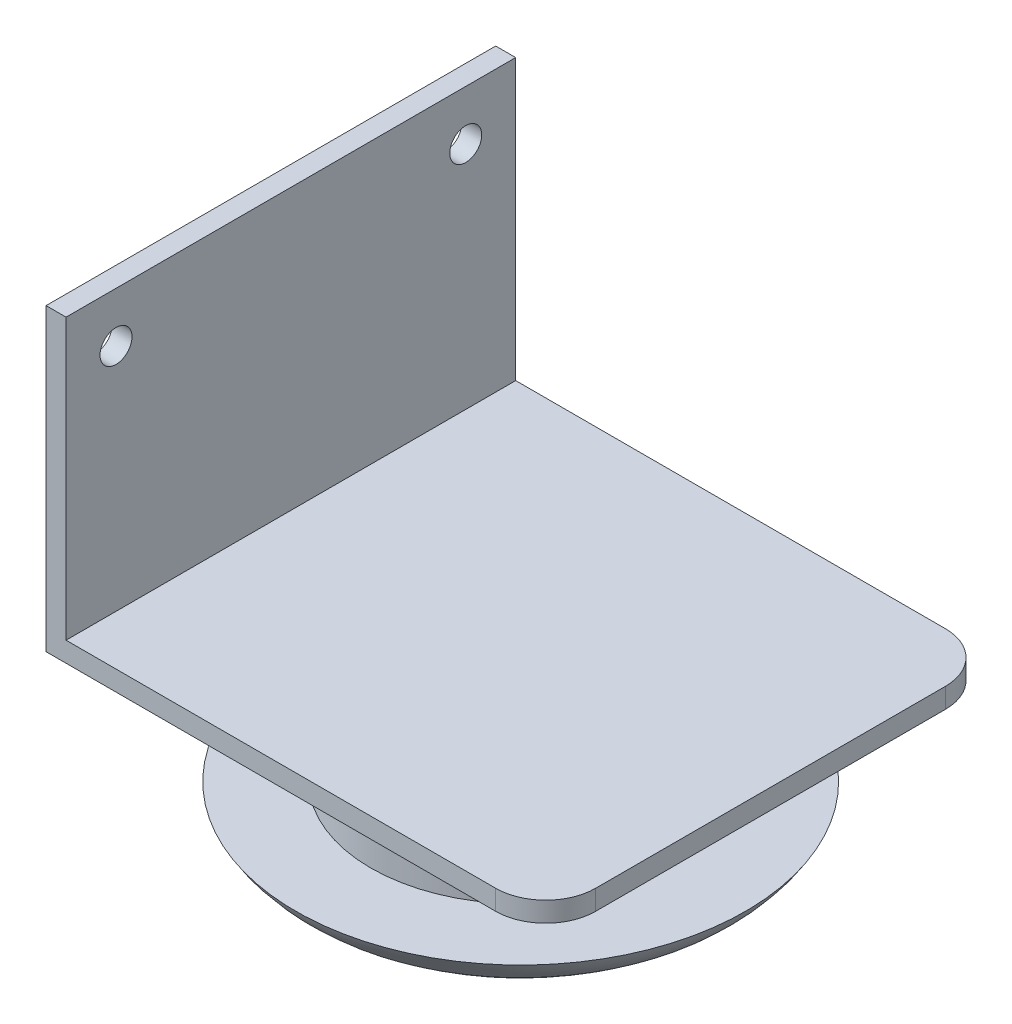
ISO-10303-21;
HEADER;
FILE_DESCRIPTION(('STEP AP214'),'2;1');
FILE_NAME('part.step','',(''),(''),'','','');
FILE_SCHEMA(('AUTOMOTIVE_DESIGN { 1 0 10303 214 1 1 1 1 }'));
ENDSEC;
DATA;
#1=APPLICATION_CONTEXT('core data for automotive mechanical design processes');
#2=APPLICATION_PROTOCOL_DEFINITION('international standard','automotive_design',2000,#1);
#3=PRODUCT_CONTEXT('',#1,'mechanical');
#4=PRODUCT('Part','Part','',(#3));
#5=PRODUCT_RELATED_PRODUCT_CATEGORY('part','',(#4));
#6=PRODUCT_DEFINITION_FORMATION('','',#4);
#7=PRODUCT_DEFINITION_CONTEXT('part definition',#1,'design');
#8=PRODUCT_DEFINITION('design','',#6,#7);
#9=PRODUCT_DEFINITION_SHAPE('','',#8);
#10=(LENGTH_UNIT() NAMED_UNIT(*) SI_UNIT(.MILLI.,.METRE.));
#11=(NAMED_UNIT(*) PLANE_ANGLE_UNIT() SI_UNIT($,.RADIAN.));
#12=(NAMED_UNIT(*) SI_UNIT($,.STERADIAN.) SOLID_ANGLE_UNIT());
#13=UNCERTAINTY_MEASURE_WITH_UNIT(LENGTH_MEASURE(1.E-05),#10,'distance_accuracy_value','');
#14=(GEOMETRIC_REPRESENTATION_CONTEXT(3) GLOBAL_UNCERTAINTY_ASSIGNED_CONTEXT((#13)) GLOBAL_UNIT_ASSIGNED_CONTEXT((#10,
#11,#12)) REPRESENTATION_CONTEXT('',''));
#15=CARTESIAN_POINT('',(0.,0.,0.));
#16=DIRECTION('',(0.,0.,1.));
#17=DIRECTION('',(1.,0.,0.));
#18=AXIS2_PLACEMENT_3D('',#15,#16,#17);
#19=CARTESIAN_POINT('',(0.,30.,45.));
#20=DIRECTION('',(0.,-1.,0.));
#21=DIRECTION('',(0.,0.,-1.));
#22=AXIS2_PLACEMENT_3D('',#19,#20,#21);
#23=PLANE('',#22);
#24=DIRECTION('',(-1.,0.,0.));
#25=VECTOR('',#24,1.);
#26=CARTESIAN_POINT('',(0.,30.,0.));
#27=LINE('',#26,#25);
#28=CARTESIAN_POINT('',(2.,30.,0.));
#29=VERTEX_POINT('',#28);
#30=CARTESIAN_POINT('',(0.,30.,0.));
#31=VERTEX_POINT('',#30);
#32=EDGE_CURVE('E126',#29,#31,#27,.T.);
#33=ORIENTED_EDGE('',*,*,#32,.T.);
#34=DIRECTION('',(0.,0.,-1.));
#35=VECTOR('',#34,1.);
#36=CARTESIAN_POINT('',(0.,30.,45.));
#37=LINE('',#36,#35);
#38=CARTESIAN_POINT('',(0.,30.,45.));
#39=VERTEX_POINT('',#38);
#40=EDGE_CURVE('E108',#39,#31,#37,.T.);
#41=ORIENTED_EDGE('',*,*,#40,.F.);
#42=DIRECTION('',(-1.,0.,0.));
#43=VECTOR('',#42,1.);
#44=CARTESIAN_POINT('',(0.,30.,45.));
#45=LINE('',#44,#43);
#46=CARTESIAN_POINT('',(2.,30.,45.));
#47=VERTEX_POINT('',#46);
#48=EDGE_CURVE('E114',#47,#39,#45,.T.);
#49=ORIENTED_EDGE('',*,*,#48,.F.);
#50=DIRECTION('',(0.,0.,-1.));
#51=VECTOR('',#50,1.);
#52=CARTESIAN_POINT('',(2.,30.,45.));
#53=LINE('',#52,#51);
#54=EDGE_CURVE('E184',#47,#29,#53,.T.);
#55=ORIENTED_EDGE('',*,*,#54,.T.);
#56=EDGE_LOOP('',(#33,#41,#49,#55));
#57=FACE_BOUND('',#56,.T.);
#58=ADVANCED_FACE('F35',(#57),#23,.F.);
#59=CARTESIAN_POINT('',(0.,30.,45.));
#60=DIRECTION('',(1.,0.,0.));
#61=DIRECTION('',(0.,0.,-1.));
#62=AXIS2_PLACEMENT_3D('',#59,#60,#61);
#63=PLANE('',#62);
#64=CARTESIAN_POINT('',(0.,25.,5.));
#65=DIRECTION('',(-1.,0.,0.));
#66=DIRECTION('',(0.,0.,1.));
#67=AXIS2_PLACEMENT_3D('',#64,#65,#66);
#68=CIRCLE('',#67,1.6);
#69=CARTESIAN_POINT('',(0.,25.,6.6));
#70=VERTEX_POINT('',#69);
#71=EDGE_CURVE('E141',#70,#70,#68,.T.);
#72=ORIENTED_EDGE('',*,*,#71,.F.);
#73=EDGE_LOOP('',(#72));
#74=FACE_BOUND('',#73,.T.);
#75=CARTESIAN_POINT('',(0.,25.,40.));
#76=DIRECTION('',(-1.,0.,0.));
#77=DIRECTION('',(0.,0.,1.));
#78=AXIS2_PLACEMENT_3D('',#75,#76,#77);
#79=CIRCLE('',#78,1.6);
#80=CARTESIAN_POINT('',(0.,25.,41.6));
#81=VERTEX_POINT('',#80);
#82=EDGE_CURVE('E138',#81,#81,#79,.T.);
#83=ORIENTED_EDGE('',*,*,#82,.F.);
#84=EDGE_LOOP('',(#83));
#85=FACE_BOUND('',#84,.T.);
#86=DIRECTION('',(0.,-1.,0.));
#87=VECTOR('',#86,1.);
#88=CARTESIAN_POINT('',(0.,30.,0.));
#89=LINE('',#88,#87);
#90=CARTESIAN_POINT('',(0.,0.,0.));
#91=VERTEX_POINT('',#90);
#92=EDGE_CURVE('E168',#31,#91,#89,.T.);
#93=ORIENTED_EDGE('',*,*,#92,.T.);
#94=DIRECTION('',(0.,0.,-1.));
#95=VECTOR('',#94,1.);
#96=CARTESIAN_POINT('',(0.,0.,45.));
#97=LINE('',#96,#95);
#98=CARTESIAN_POINT('',(0.,0.,45.));
#99=VERTEX_POINT('',#98);
#100=EDGE_CURVE('E111',#99,#91,#97,.T.);
#101=ORIENTED_EDGE('',*,*,#100,.F.);
#102=DIRECTION('',(0.,-1.,0.));
#103=VECTOR('',#102,1.);
#104=CARTESIAN_POINT('',(0.,30.,45.));
#105=LINE('',#104,#103);
#106=EDGE_CURVE('E104',#39,#99,#105,.T.);
#107=ORIENTED_EDGE('',*,*,#106,.F.);
#108=ORIENTED_EDGE('',*,*,#40,.T.);
#109=EDGE_LOOP('',(#93,#101,#107,#108));
#110=FACE_BOUND('',#109,.T.);
#111=ADVANCED_FACE('F106',(#74,#85,#110),#63,.F.);
#112=CARTESIAN_POINT('',(0.,0.,45.));
#113=DIRECTION('',(0.,1.,0.));
#114=DIRECTION('',(0.,0.,1.));
#115=AXIS2_PLACEMENT_3D('',#112,#113,#114);
#116=PLANE('',#115);
#117=CARTESIAN_POINT('',(25.,0.,22.5));
#118=DIRECTION('',(0.,1.,0.));
#119=DIRECTION('',(0.,0.,1.));
#120=AXIS2_PLACEMENT_3D('',#117,#118,#119);
#121=CIRCLE('',#120,15.);
#122=CARTESIAN_POINT('',(25.,0.,37.5));
#123=VERTEX_POINT('',#122);
#124=EDGE_CURVE('E43',#123,#123,#121,.F.);
#125=ORIENTED_EDGE('',*,*,#124,.F.);
#126=EDGE_LOOP('',(#125));
#127=FACE_BOUND('',#126,.T.);
#128=DIRECTION('',(1.,0.,0.));
#129=VECTOR('',#128,1.);
#130=CARTESIAN_POINT('',(0.,0.,0.));
#131=LINE('',#130,#129);
#132=CARTESIAN_POINT('',(45.,0.,0.));
#133=VERTEX_POINT('',#132);
#134=EDGE_CURVE('E164',#91,#133,#131,.T.);
#135=ORIENTED_EDGE('',*,*,#134,.T.);
#136=CARTESIAN_POINT('',(45.,0.,5.));
#137=DIRECTION('',(0.,1.,0.));
#138=DIRECTION('',(0.,0.,1.));
#139=AXIS2_PLACEMENT_3D('',#136,#137,#138);
#140=CIRCLE('',#139,5.);
#141=CARTESIAN_POINT('',(50.,0.,5.00000000000001));
#142=VERTEX_POINT('',#141);
#143=EDGE_CURVE('E151',#133,#142,#140,.F.);
#144=ORIENTED_EDGE('',*,*,#143,.T.);
#145=DIRECTION('',(0.,0.,-1.));
#146=VECTOR('',#145,1.);
#147=CARTESIAN_POINT('',(50.,0.,45.));
#148=LINE('',#147,#146);
#149=CARTESIAN_POINT('',(50.,0.,40.));
#150=VERTEX_POINT('',#149);
#151=EDGE_CURVE('E131',#150,#142,#148,.T.);
#152=ORIENTED_EDGE('',*,*,#151,.F.);
#153=CARTESIAN_POINT('',(45.,0.,40.));
#154=DIRECTION('',(0.,1.,0.));
#155=DIRECTION('',(0.,0.,1.));
#156=AXIS2_PLACEMENT_3D('',#153,#154,#155);
#157=CIRCLE('',#156,5.);
#158=CARTESIAN_POINT('',(45.,0.,45.));
#159=VERTEX_POINT('',#158);
#160=EDGE_CURVE('E50',#150,#159,#157,.F.);
#161=ORIENTED_EDGE('',*,*,#160,.T.);
#162=DIRECTION('',(1.,0.,0.));
#163=VECTOR('',#162,1.);
#164=CARTESIAN_POINT('',(0.,0.,45.));
#165=LINE('',#164,#163);
#166=EDGE_CURVE('E113',#99,#159,#165,.T.);
#167=ORIENTED_EDGE('',*,*,#166,.F.);
#168=ORIENTED_EDGE('',*,*,#100,.T.);
#169=EDGE_LOOP('',(#135,#144,#152,#161,#167,#168));
#170=FACE_BOUND('',#169,.T.);
#171=ADVANCED_FACE('F160',(#127,#170),#116,.F.);
#172=CARTESIAN_POINT('',(50.,2.,45.));
#173=DIRECTION('',(-1.,0.,0.));
#174=DIRECTION('',(0.,0.,1.));
#175=AXIS2_PLACEMENT_3D('',#172,#173,#174);
#176=PLANE('',#175);
#177=ORIENTED_EDGE('',*,*,#151,.T.);
#178=DIRECTION('',(0.,1.,0.));
#179=VECTOR('',#178,1.);
#180=CARTESIAN_POINT('',(50.,2.,5.));
#181=LINE('',#180,#179);
#182=CARTESIAN_POINT('',(50.,2.,5.00000000000001));
#183=VERTEX_POINT('',#182);
#184=EDGE_CURVE('E129',#142,#183,#181,.T.);
#185=ORIENTED_EDGE('',*,*,#184,.T.);
#186=DIRECTION('',(0.,0.,-1.));
#187=VECTOR('',#186,1.);
#188=CARTESIAN_POINT('',(50.,2.,45.));
#189=LINE('',#188,#187);
#190=CARTESIAN_POINT('',(50.,2.,40.));
#191=VERTEX_POINT('',#190);
#192=EDGE_CURVE('E176',#191,#183,#189,.T.);
#193=ORIENTED_EDGE('',*,*,#192,.F.);
#194=DIRECTION('',(0.,1.,0.));
#195=VECTOR('',#194,1.);
#196=CARTESIAN_POINT('',(50.,2.,40.));
#197=LINE('',#196,#195);
#198=EDGE_CURVE('E127',#191,#150,#197,.F.);
#199=ORIENTED_EDGE('',*,*,#198,.T.);
#200=EDGE_LOOP('',(#177,#185,#193,#199));
#201=FACE_BOUND('',#200,.T.);
#202=ADVANCED_FACE('F162',(#201),#176,.F.);
#203=CARTESIAN_POINT('',(2.,2.,45.));
#204=DIRECTION('',(0.,-1.,0.));
#205=DIRECTION('',(0.,0.,-1.));
#206=AXIS2_PLACEMENT_3D('',#203,#204,#205);
#207=PLANE('',#206);
#208=ORIENTED_EDGE('',*,*,#192,.T.);
#209=CARTESIAN_POINT('',(45.,2.,5.));
#210=DIRECTION('',(0.,-1.,0.));
#211=DIRECTION('',(0.,0.,-1.));
#212=AXIS2_PLACEMENT_3D('',#209,#210,#211);
#213=CIRCLE('',#212,5.);
#214=CARTESIAN_POINT('',(45.,2.,0.));
#215=VERTEX_POINT('',#214);
#216=EDGE_CURVE('E147',#183,#215,#213,.F.);
#217=ORIENTED_EDGE('',*,*,#216,.T.);
#218=DIRECTION('',(-1.,0.,0.));
#219=VECTOR('',#218,1.);
#220=CARTESIAN_POINT('',(2.,2.,0.));
#221=LINE('',#220,#219);
#222=CARTESIAN_POINT('',(2.,2.,0.));
#223=VERTEX_POINT('',#222);
#224=EDGE_CURVE('E167',#215,#223,#221,.T.);
#225=ORIENTED_EDGE('',*,*,#224,.T.);
#226=DIRECTION('',(0.,0.,-1.));
#227=VECTOR('',#226,1.);
#228=CARTESIAN_POINT('',(2.,2.,45.));
#229=LINE('',#228,#227);
#230=CARTESIAN_POINT('',(2.,2.,45.));
#231=VERTEX_POINT('',#230);
#232=EDGE_CURVE('E181',#231,#223,#229,.T.);
#233=ORIENTED_EDGE('',*,*,#232,.F.);
#234=DIRECTION('',(-1.,0.,0.));
#235=VECTOR('',#234,1.);
#236=CARTESIAN_POINT('',(2.,2.,45.));
#237=LINE('',#236,#235);
#238=CARTESIAN_POINT('',(45.,2.,45.));
#239=VERTEX_POINT('',#238);
#240=EDGE_CURVE('E193',#239,#231,#237,.T.);
#241=ORIENTED_EDGE('',*,*,#240,.F.);
#242=CARTESIAN_POINT('',(45.,2.,40.));
#243=DIRECTION('',(0.,-1.,0.));
#244=DIRECTION('',(0.,0.,-1.));
#245=AXIS2_PLACEMENT_3D('',#242,#243,#244);
#246=CIRCLE('',#245,5.);
#247=EDGE_CURVE('E145',#239,#191,#246,.F.);
#248=ORIENTED_EDGE('',*,*,#247,.T.);
#249=EDGE_LOOP('',(#208,#217,#225,#233,#241,#248));
#250=FACE_BOUND('',#249,.T.);
#251=ADVANCED_FACE('F179',(#250),#207,.F.);
#252=CARTESIAN_POINT('',(2.,30.,45.));
#253=DIRECTION('',(-1.,0.,0.));
#254=DIRECTION('',(0.,-1.,0.));
#255=AXIS2_PLACEMENT_3D('',#252,#253,#254);
#256=PLANE('',#255);
#257=CARTESIAN_POINT('',(2.,25.,5.));
#258=DIRECTION('',(-1.,0.,0.));
#259=DIRECTION('',(0.,-1.,0.));
#260=AXIS2_PLACEMENT_3D('',#257,#258,#259);
#261=CIRCLE('',#260,1.6);
#262=CARTESIAN_POINT('',(2.,23.4,5.));
#263=VERTEX_POINT('',#262);
#264=EDGE_CURVE('E139',#263,#263,#261,.T.);
#265=ORIENTED_EDGE('',*,*,#264,.T.);
#266=EDGE_LOOP('',(#265));
#267=FACE_BOUND('',#266,.T.);
#268=CARTESIAN_POINT('',(2.,25.,40.));
#269=DIRECTION('',(-1.,0.,0.));
#270=DIRECTION('',(0.,-1.,0.));
#271=AXIS2_PLACEMENT_3D('',#268,#269,#270);
#272=CIRCLE('',#271,1.6);
#273=CARTESIAN_POINT('',(2.,23.4,40.));
#274=VERTEX_POINT('',#273);
#275=EDGE_CURVE('E135',#274,#274,#272,.T.);
#276=ORIENTED_EDGE('',*,*,#275,.T.);
#277=EDGE_LOOP('',(#276));
#278=FACE_BOUND('',#277,.T.);
#279=DIRECTION('',(0.,1.,0.));
#280=VECTOR('',#279,1.);
#281=CARTESIAN_POINT('',(2.,30.,0.));
#282=LINE('',#281,#280);
#283=EDGE_CURVE('E123',#223,#29,#282,.T.);
#284=ORIENTED_EDGE('',*,*,#283,.T.);
#285=ORIENTED_EDGE('',*,*,#54,.F.);
#286=DIRECTION('',(0.,1.,0.));
#287=VECTOR('',#286,1.);
#288=CARTESIAN_POINT('',(2.,30.,45.));
#289=LINE('',#288,#287);
#290=EDGE_CURVE('E119',#231,#47,#289,.T.);
#291=ORIENTED_EDGE('',*,*,#290,.F.);
#292=ORIENTED_EDGE('',*,*,#232,.T.);
#293=EDGE_LOOP('',(#284,#285,#291,#292));
#294=FACE_BOUND('',#293,.T.);
#295=ADVANCED_FACE('F242',(#267,#278,#294),#256,.F.);
#296=CARTESIAN_POINT('',(0.,0.,45.));
#297=DIRECTION('',(0.,0.,-1.));
#298=DIRECTION('',(-1.,0.,0.));
#299=AXIS2_PLACEMENT_3D('',#296,#297,#298);
#300=PLANE('',#299);
#301=ORIENTED_EDGE('',*,*,#166,.T.);
#302=DIRECTION('',(0.,1.,0.));
#303=VECTOR('',#302,1.);
#304=CARTESIAN_POINT('',(45.,0.,45.));
#305=LINE('',#304,#303);
#306=EDGE_CURVE('E153',#159,#239,#305,.T.);
#307=ORIENTED_EDGE('',*,*,#306,.T.);
#308=ORIENTED_EDGE('',*,*,#240,.T.);
#309=ORIENTED_EDGE('',*,*,#290,.T.);
#310=ORIENTED_EDGE('',*,*,#48,.T.);
#311=ORIENTED_EDGE('',*,*,#106,.T.);
#312=EDGE_LOOP('',(#301,#307,#308,#309,#310,#311));
#313=FACE_BOUND('',#312,.T.);
#314=ADVANCED_FACE('F117',(#313),#300,.F.);
#315=CARTESIAN_POINT('',(0.,0.,0.));
#316=DIRECTION('',(0.,0.,-1.));
#317=DIRECTION('',(-1.,0.,0.));
#318=AXIS2_PLACEMENT_3D('',#315,#316,#317);
#319=PLANE('',#318);
#320=ORIENTED_EDGE('',*,*,#224,.F.);
#321=DIRECTION('',(0.,1.,0.));
#322=VECTOR('',#321,1.);
#323=CARTESIAN_POINT('',(45.,0.,0.));
#324=LINE('',#323,#322);
#325=EDGE_CURVE('E58',#215,#133,#324,.F.);
#326=ORIENTED_EDGE('',*,*,#325,.T.);
#327=ORIENTED_EDGE('',*,*,#134,.F.);
#328=ORIENTED_EDGE('',*,*,#92,.F.);
#329=ORIENTED_EDGE('',*,*,#32,.F.);
#330=ORIENTED_EDGE('',*,*,#283,.F.);
#331=EDGE_LOOP('',(#320,#326,#327,#328,#329,#330));
#332=FACE_BOUND('',#331,.T.);
#333=ADVANCED_FACE('F243',(#332),#319,.T.);
#334=CARTESIAN_POINT('',(35.,25.,40.));
#335=DIRECTION('',(-1.,0.,0.));
#336=DIRECTION('',(0.,0.,1.));
#337=AXIS2_PLACEMENT_3D('',#334,#335,#336);
#338=CYLINDRICAL_SURFACE('',#337,1.6);
#339=ORIENTED_EDGE('',*,*,#82,.T.);
#340=EDGE_LOOP('',(#339));
#341=FACE_BOUND('',#340,.T.);
#342=ORIENTED_EDGE('',*,*,#275,.F.);
#343=EDGE_LOOP('',(#342));
#344=FACE_BOUND('',#343,.T.);
#345=ADVANCED_FACE('F245',(#341,#344),#338,.F.);
#346=CARTESIAN_POINT('',(35.,25.,5.));
#347=DIRECTION('',(-1.,0.,0.));
#348=DIRECTION('',(0.,0.,1.));
#349=AXIS2_PLACEMENT_3D('',#346,#347,#348);
#350=CYLINDRICAL_SURFACE('',#349,1.6);
#351=ORIENTED_EDGE('',*,*,#71,.T.);
#352=EDGE_LOOP('',(#351));
#353=FACE_BOUND('',#352,.T.);
#354=ORIENTED_EDGE('',*,*,#264,.F.);
#355=EDGE_LOOP('',(#354));
#356=FACE_BOUND('',#355,.T.);
#357=ADVANCED_FACE('F231',(#353,#356),#350,.F.);
#358=CARTESIAN_POINT('',(45.,2.,5.));
#359=DIRECTION('',(0.,-1.,0.));
#360=DIRECTION('',(0.,0.,-1.));
#361=AXIS2_PLACEMENT_3D('',#358,#359,#360);
#362=CYLINDRICAL_SURFACE('',#361,5.);
#363=ORIENTED_EDGE('',*,*,#143,.F.);
#364=ORIENTED_EDGE('',*,*,#325,.F.);
#365=ORIENTED_EDGE('',*,*,#216,.F.);
#366=ORIENTED_EDGE('',*,*,#184,.F.);
#367=EDGE_LOOP('',(#363,#364,#365,#366));
#368=FACE_BOUND('',#367,.T.);
#369=ADVANCED_FACE('F172',(#368),#362,.T.);
#370=CARTESIAN_POINT('',(45.,0.,40.));
#371=DIRECTION('',(0.,1.,0.));
#372=DIRECTION('',(0.,0.,1.));
#373=AXIS2_PLACEMENT_3D('',#370,#371,#372);
#374=CYLINDRICAL_SURFACE('',#373,5.);
#375=ORIENTED_EDGE('',*,*,#160,.F.);
#376=ORIENTED_EDGE('',*,*,#198,.F.);
#377=ORIENTED_EDGE('',*,*,#247,.F.);
#378=ORIENTED_EDGE('',*,*,#306,.F.);
#379=EDGE_LOOP('',(#375,#376,#377,#378));
#380=FACE_BOUND('',#379,.T.);
#381=ADVANCED_FACE('F230',(#380),#374,.T.);
#382=CARTESIAN_POINT('',(25.,-10.,22.5));
#383=DIRECTION('',(0.,1.,0.));
#384=DIRECTION('',(0.,0.,1.));
#385=AXIS2_PLACEMENT_3D('',#382,#383,#384);
#386=CYLINDRICAL_SURFACE('',#385,15.);
#387=CARTESIAN_POINT('',(25.,-10.,22.5));
#388=DIRECTION('',(0.,-1.,0.));
#389=DIRECTION('',(0.,0.,-1.));
#390=AXIS2_PLACEMENT_3D('',#387,#388,#389);
#391=CIRCLE('',#390,15.);
#392=CARTESIAN_POINT('',(25.,-10.,7.5));
#393=VERTEX_POINT('',#392);
#394=EDGE_CURVE('E200',#393,#393,#391,.T.);
#395=ORIENTED_EDGE('',*,*,#394,.F.);
#396=EDGE_LOOP('',(#395));
#397=FACE_BOUND('',#396,.T.);
#398=ORIENTED_EDGE('',*,*,#124,.T.);
#399=EDGE_LOOP('',(#398));
#400=FACE_BOUND('',#399,.T.);
#401=ADVANCED_FACE('F158',(#397,#400),#386,.T.);
#402=CARTESIAN_POINT('',(25.,-15.,22.5));
#403=DIRECTION('',(0.,-1.,0.));
#404=DIRECTION('',(0.,0.,-1.));
#405=AXIS2_PLACEMENT_3D('',#402,#403,#404);
#406=PLANE('',#405);
#407=CARTESIAN_POINT('',(25.,-15.,22.5));
#408=DIRECTION('',(0.,-1.,0.));
#409=DIRECTION('',(0.,0.,-1.));
#410=AXIS2_PLACEMENT_3D('',#407,#408,#409);
#411=CIRCLE('',#410,13.8397459621556);
#412=CARTESIAN_POINT('',(25.,-15.,8.66025403784438));
#413=VERTEX_POINT('',#412);
#414=EDGE_CURVE('E11',#413,#413,#411,.T.);
#415=ORIENTED_EDGE('',*,*,#414,.T.);
#416=EDGE_LOOP('',(#415));
#417=FACE_BOUND('',#416,.T.);
#418=ADVANCED_FACE('F211',(#417),#406,.T.);
#419=CARTESIAN_POINT('',(25.,-10.,22.5));
#420=DIRECTION('',(0.,-1.,0.));
#421=DIRECTION('',(0.,0.,-1.));
#422=AXIS2_PLACEMENT_3D('',#419,#420,#421);
#423=PLANE('',#422);
#424=ORIENTED_EDGE('',*,*,#394,.T.);
#425=EDGE_LOOP('',(#424));
#426=FACE_BOUND('',#425,.T.);
#427=CARTESIAN_POINT('',(25.,-10.,22.5));
#428=DIRECTION('',(0.,-1.,0.));
#429=DIRECTION('',(0.,0.,-1.));
#430=AXIS2_PLACEMENT_3D('',#427,#428,#429);
#431=CIRCLE('',#430,22.5);
#432=CARTESIAN_POINT('',(25.,-10.,0.));
#433=VERTEX_POINT('',#432);
#434=EDGE_CURVE('E203',#433,#433,#431,.T.);
#435=ORIENTED_EDGE('',*,*,#434,.F.);
#436=EDGE_LOOP('',(#435));
#437=FACE_BOUND('',#436,.T.);
#438=ADVANCED_FACE('F209',(#426,#437),#423,.F.);
#439=CARTESIAN_POINT('',(25.,-5.,22.5));
#440=DIRECTION('',(0.,1.,0.));
#441=DIRECTION('',(0.,0.,1.));
#442=AXIS2_PLACEMENT_3D('',#439,#440,#441);
#443=TOROIDAL_SURFACE('',#442,13.8397459621556,10.);
#444=ORIENTED_EDGE('',*,*,#434,.T.);
#445=EDGE_LOOP('',(#444));
#446=FACE_BOUND('',#445,.T.);
#447=ORIENTED_EDGE('',*,*,#414,.F.);
#448=EDGE_LOOP('',(#447));
#449=FACE_BOUND('',#448,.T.);
#450=ADVANCED_FACE('F37',(#446,#449),#443,.T.);
#451=CLOSED_SHELL('',(#58,#111,#171,#202,#251,#295,#314,#333,#345,#357,#369,#381,#401,#418,#438,#450));
#452=MANIFOLD_SOLID_BREP('B2',#451);
#453=ADVANCED_BREP_SHAPE_REPRESENTATION('',(#18,#452),#14);
#454=SHAPE_DEFINITION_REPRESENTATION(#9,#453);
ENDSEC;
END-ISO-10303-21;
